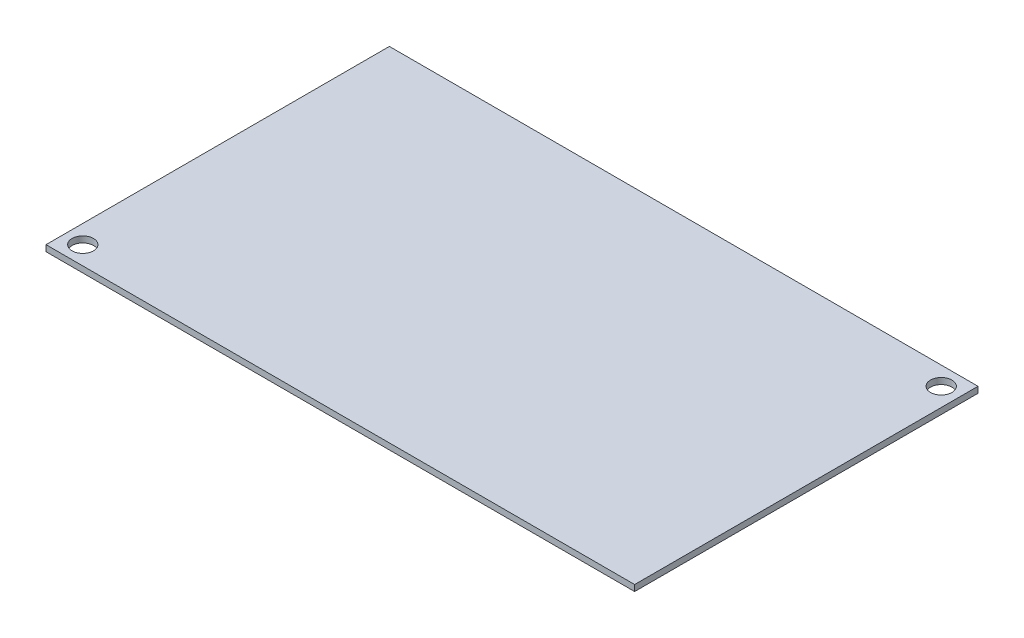
ISO-10303-21;
HEADER;
FILE_DESCRIPTION(('STEP AP214'),'2;1');
FILE_NAME('part.step','',(''),(''),'','','');
FILE_SCHEMA(('AUTOMOTIVE_DESIGN { 1 0 10303 214 1 1 1 1 }'));
ENDSEC;
DATA;
#1=APPLICATION_CONTEXT('core data for automotive mechanical design processes');
#2=APPLICATION_PROTOCOL_DEFINITION('international standard','automotive_design',2000,#1);
#3=PRODUCT_CONTEXT('',#1,'mechanical');
#4=PRODUCT('Part','Part','',(#3));
#5=PRODUCT_RELATED_PRODUCT_CATEGORY('part','',(#4));
#6=PRODUCT_DEFINITION_FORMATION('','',#4);
#7=PRODUCT_DEFINITION_CONTEXT('part definition',#1,'design');
#8=PRODUCT_DEFINITION('design','',#6,#7);
#9=PRODUCT_DEFINITION_SHAPE('','',#8);
#10=(LENGTH_UNIT() NAMED_UNIT(*) SI_UNIT(.MILLI.,.METRE.));
#11=(NAMED_UNIT(*) PLANE_ANGLE_UNIT() SI_UNIT($,.RADIAN.));
#12=(NAMED_UNIT(*) SI_UNIT($,.STERADIAN.) SOLID_ANGLE_UNIT());
#13=UNCERTAINTY_MEASURE_WITH_UNIT(LENGTH_MEASURE(1.E-05),#10,'distance_accuracy_value','');
#14=(GEOMETRIC_REPRESENTATION_CONTEXT(3) GLOBAL_UNCERTAINTY_ASSIGNED_CONTEXT((#13)) GLOBAL_UNIT_ASSIGNED_CONTEXT((#10,
#11,#12)) REPRESENTATION_CONTEXT('',''));
#15=CARTESIAN_POINT('',(0.,0.,0.));
#16=DIRECTION('',(0.,0.,1.));
#17=DIRECTION('',(1.,0.,0.));
#18=AXIS2_PLACEMENT_3D('',#15,#16,#17);
#19=CARTESIAN_POINT('',(0.,1.27,-71.12));
#20=DIRECTION('',(0.,-1.,0.));
#21=DIRECTION('',(0.,0.,-1.));
#22=AXIS2_PLACEMENT_3D('',#19,#20,#21);
#23=PLANE('',#22);
#24=CARTESIAN_POINT('',(3.81,1.27,-3.81));
#25=DIRECTION('',(0.,1.,0.));
#26=DIRECTION('',(0.,0.,1.));
#27=AXIS2_PLACEMENT_3D('',#24,#25,#26);
#28=CIRCLE('',#27,2.2225);
#29=CARTESIAN_POINT('',(3.81,1.27,-1.5875));
#30=VERTEX_POINT('',#29);
#31=EDGE_CURVE('E101',#30,#30,#28,.T.);
#32=ORIENTED_EDGE('',*,*,#31,.F.);
#33=EDGE_LOOP('',(#32));
#34=FACE_BOUND('',#33,.T.);
#35=DIRECTION('',(0.,0.,1.));
#36=VECTOR('',#35,1.);
#37=CARTESIAN_POINT('',(0.,1.27,0.));
#38=LINE('',#37,#36);
#39=CARTESIAN_POINT('',(0.,1.27,-71.12));
#40=VERTEX_POINT('',#39);
#41=CARTESIAN_POINT('',(0.,1.27,0.));
#42=VERTEX_POINT('',#41);
#43=EDGE_CURVE('E86',#40,#42,#38,.T.);
#44=ORIENTED_EDGE('',*,*,#43,.T.);
#45=DIRECTION('',(1.,0.,0.));
#46=VECTOR('',#45,1.);
#47=CARTESIAN_POINT('',(0.,1.27,0.));
#48=LINE('',#47,#46);
#49=CARTESIAN_POINT('',(121.92,1.27,0.));
#50=VERTEX_POINT('',#49);
#51=EDGE_CURVE('E81',#42,#50,#48,.T.);
#52=ORIENTED_EDGE('',*,*,#51,.T.);
#53=DIRECTION('',(0.,0.,-1.));
#54=VECTOR('',#53,1.);
#55=CARTESIAN_POINT('',(121.92,1.27,0.));
#56=LINE('',#55,#54);
#57=CARTESIAN_POINT('',(121.92,1.27,-71.12));
#58=VERTEX_POINT('',#57);
#59=EDGE_CURVE('E84',#50,#58,#56,.T.);
#60=ORIENTED_EDGE('',*,*,#59,.T.);
#61=DIRECTION('',(-1.,0.,0.));
#62=VECTOR('',#61,1.);
#63=CARTESIAN_POINT('',(0.,1.27,-71.12));
#64=LINE('',#63,#62);
#65=EDGE_CURVE('E51',#58,#40,#64,.T.);
#66=ORIENTED_EDGE('',*,*,#65,.T.);
#67=EDGE_LOOP('',(#44,#52,#60,#66));
#68=FACE_BOUND('',#67,.T.);
#69=CARTESIAN_POINT('',(118.11,1.27,-67.31));
#70=DIRECTION('',(0.,1.,0.));
#71=DIRECTION('',(0.,0.,1.));
#72=AXIS2_PLACEMENT_3D('',#69,#70,#71);
#73=CIRCLE('',#72,2.2225);
#74=CARTESIAN_POINT('',(118.11,1.27,-65.0875));
#75=VERTEX_POINT('',#74);
#76=EDGE_CURVE('E116',#75,#75,#73,.T.);
#77=ORIENTED_EDGE('',*,*,#76,.F.);
#78=EDGE_LOOP('',(#77));
#79=FACE_BOUND('',#78,.T.);
#80=ADVANCED_FACE('F34',(#34,#68,#79),#23,.F.);
#81=CARTESIAN_POINT('',(0.,0.,-71.12));
#82=DIRECTION('',(0.,-1.,0.));
#83=DIRECTION('',(0.,0.,-1.));
#84=AXIS2_PLACEMENT_3D('',#81,#82,#83);
#85=PLANE('',#84);
#86=CARTESIAN_POINT('',(3.81,0.,-3.81));
#87=DIRECTION('',(0.,1.,0.));
#88=DIRECTION('',(0.,0.,1.));
#89=AXIS2_PLACEMENT_3D('',#86,#87,#88);
#90=CIRCLE('',#89,2.2225);
#91=CARTESIAN_POINT('',(3.81,0.,-1.5875));
#92=VERTEX_POINT('',#91);
#93=EDGE_CURVE('E113',#92,#92,#90,.T.);
#94=ORIENTED_EDGE('',*,*,#93,.T.);
#95=EDGE_LOOP('',(#94));
#96=FACE_BOUND('',#95,.T.);
#97=DIRECTION('',(0.,0.,1.));
#98=VECTOR('',#97,1.);
#99=CARTESIAN_POINT('',(0.,0.,0.));
#100=LINE('',#99,#98);
#101=CARTESIAN_POINT('',(0.,0.,-71.12));
#102=VERTEX_POINT('',#101);
#103=CARTESIAN_POINT('',(0.,0.,0.));
#104=VERTEX_POINT('',#103);
#105=EDGE_CURVE('E98',#102,#104,#100,.T.);
#106=ORIENTED_EDGE('',*,*,#105,.F.);
#107=DIRECTION('',(-1.,0.,0.));
#108=VECTOR('',#107,1.);
#109=CARTESIAN_POINT('',(0.,0.,-71.12));
#110=LINE('',#109,#108);
#111=CARTESIAN_POINT('',(121.92,0.,-71.12));
#112=VERTEX_POINT('',#111);
#113=EDGE_CURVE('E74',#112,#102,#110,.T.);
#114=ORIENTED_EDGE('',*,*,#113,.F.);
#115=DIRECTION('',(0.,0.,-1.));
#116=VECTOR('',#115,1.);
#117=CARTESIAN_POINT('',(121.92,0.,0.));
#118=LINE('',#117,#116);
#119=CARTESIAN_POINT('',(121.92,0.,0.));
#120=VERTEX_POINT('',#119);
#121=EDGE_CURVE('E68',#120,#112,#118,.T.);
#122=ORIENTED_EDGE('',*,*,#121,.F.);
#123=DIRECTION('',(1.,0.,0.));
#124=VECTOR('',#123,1.);
#125=CARTESIAN_POINT('',(0.,0.,0.));
#126=LINE('',#125,#124);
#127=EDGE_CURVE('E90',#104,#120,#126,.T.);
#128=ORIENTED_EDGE('',*,*,#127,.F.);
#129=EDGE_LOOP('',(#106,#114,#122,#128));
#130=FACE_BOUND('',#129,.T.);
#131=CARTESIAN_POINT('',(118.11,0.,-67.31));
#132=DIRECTION('',(0.,1.,0.));
#133=DIRECTION('',(0.,0.,1.));
#134=AXIS2_PLACEMENT_3D('',#131,#132,#133);
#135=CIRCLE('',#134,2.2225);
#136=CARTESIAN_POINT('',(118.11,0.,-65.0875));
#137=VERTEX_POINT('',#136);
#138=EDGE_CURVE('E119',#137,#137,#135,.T.);
#139=ORIENTED_EDGE('',*,*,#138,.T.);
#140=EDGE_LOOP('',(#139));
#141=FACE_BOUND('',#140,.T.);
#142=ADVANCED_FACE('F109',(#96,#130,#141),#85,.T.);
#143=CARTESIAN_POINT('',(0.,1.27,0.));
#144=DIRECTION('',(1.,0.,0.));
#145=DIRECTION('',(0.,0.,-1.));
#146=AXIS2_PLACEMENT_3D('',#143,#144,#145);
#147=PLANE('',#146);
#148=ORIENTED_EDGE('',*,*,#105,.T.);
#149=DIRECTION('',(0.,-1.,0.));
#150=VECTOR('',#149,1.);
#151=CARTESIAN_POINT('',(0.,1.27,0.));
#152=LINE('',#151,#150);
#153=EDGE_CURVE('E11',#42,#104,#152,.T.);
#154=ORIENTED_EDGE('',*,*,#153,.F.);
#155=ORIENTED_EDGE('',*,*,#43,.F.);
#156=DIRECTION('',(0.,-1.,0.));
#157=VECTOR('',#156,1.);
#158=CARTESIAN_POINT('',(0.,1.27,-71.12));
#159=LINE('',#158,#157);
#160=EDGE_CURVE('E94',#40,#102,#159,.T.);
#161=ORIENTED_EDGE('',*,*,#160,.T.);
#162=EDGE_LOOP('',(#148,#154,#155,#161));
#163=FACE_BOUND('',#162,.T.);
#164=ADVANCED_FACE('F36',(#163),#147,.F.);
#165=CARTESIAN_POINT('',(0.,1.27,0.));
#166=DIRECTION('',(0.,0.,-1.));
#167=DIRECTION('',(-1.,0.,0.));
#168=AXIS2_PLACEMENT_3D('',#165,#166,#167);
#169=PLANE('',#168);
#170=ORIENTED_EDGE('',*,*,#127,.T.);
#171=DIRECTION('',(0.,-1.,0.));
#172=VECTOR('',#171,1.);
#173=CARTESIAN_POINT('',(121.92,1.27,0.));
#174=LINE('',#173,#172);
#175=EDGE_CURVE('E43',#50,#120,#174,.T.);
#176=ORIENTED_EDGE('',*,*,#175,.F.);
#177=ORIENTED_EDGE('',*,*,#51,.F.);
#178=ORIENTED_EDGE('',*,*,#153,.T.);
#179=EDGE_LOOP('',(#170,#176,#177,#178));
#180=FACE_BOUND('',#179,.T.);
#181=ADVANCED_FACE('F89',(#180),#169,.F.);
#182=CARTESIAN_POINT('',(121.92,1.27,0.));
#183=DIRECTION('',(-1.,0.,0.));
#184=DIRECTION('',(0.,0.,1.));
#185=AXIS2_PLACEMENT_3D('',#182,#183,#184);
#186=PLANE('',#185);
#187=ORIENTED_EDGE('',*,*,#121,.T.);
#188=DIRECTION('',(0.,-1.,0.));
#189=VECTOR('',#188,1.);
#190=CARTESIAN_POINT('',(121.92,1.27,-71.12));
#191=LINE('',#190,#189);
#192=EDGE_CURVE('E91',#58,#112,#191,.T.);
#193=ORIENTED_EDGE('',*,*,#192,.F.);
#194=ORIENTED_EDGE('',*,*,#59,.F.);
#195=ORIENTED_EDGE('',*,*,#175,.T.);
#196=EDGE_LOOP('',(#187,#193,#194,#195));
#197=FACE_BOUND('',#196,.T.);
#198=ADVANCED_FACE('F92',(#197),#186,.F.);
#199=CARTESIAN_POINT('',(0.,1.27,-71.12));
#200=DIRECTION('',(0.,0.,1.));
#201=DIRECTION('',(1.,0.,0.));
#202=AXIS2_PLACEMENT_3D('',#199,#200,#201);
#203=PLANE('',#202);
#204=ORIENTED_EDGE('',*,*,#113,.T.);
#205=ORIENTED_EDGE('',*,*,#160,.F.);
#206=ORIENTED_EDGE('',*,*,#65,.F.);
#207=ORIENTED_EDGE('',*,*,#192,.T.);
#208=EDGE_LOOP('',(#204,#205,#206,#207));
#209=FACE_BOUND('',#208,.T.);
#210=ADVANCED_FACE('F106',(#209),#203,.F.);
#211=CARTESIAN_POINT('',(3.81,1.27,-3.81));
#212=DIRECTION('',(0.,-1.,0.));
#213=DIRECTION('',(0.,0.,-1.));
#214=AXIS2_PLACEMENT_3D('',#211,#212,#213);
#215=CYLINDRICAL_SURFACE('',#214,2.2225);
#216=ORIENTED_EDGE('',*,*,#31,.T.);
#217=EDGE_LOOP('',(#216));
#218=FACE_BOUND('',#217,.T.);
#219=ORIENTED_EDGE('',*,*,#93,.F.);
#220=EDGE_LOOP('',(#219));
#221=FACE_BOUND('',#220,.T.);
#222=ADVANCED_FACE('F137',(#218,#221),#215,.F.);
#223=CARTESIAN_POINT('',(118.11,1.27,-67.31));
#224=DIRECTION('',(0.,-1.,0.));
#225=DIRECTION('',(0.,0.,-1.));
#226=AXIS2_PLACEMENT_3D('',#223,#224,#225);
#227=CYLINDRICAL_SURFACE('',#226,2.2225);
#228=ORIENTED_EDGE('',*,*,#76,.T.);
#229=EDGE_LOOP('',(#228));
#230=FACE_BOUND('',#229,.T.);
#231=ORIENTED_EDGE('',*,*,#138,.F.);
#232=EDGE_LOOP('',(#231));
#233=FACE_BOUND('',#232,.T.);
#234=ADVANCED_FACE('F125',(#230,#233),#227,.F.);
#235=CLOSED_SHELL('',(#80,#142,#164,#181,#198,#210,#222,#234));
#236=MANIFOLD_SOLID_BREP('B2',#235);
#237=ADVANCED_BREP_SHAPE_REPRESENTATION('',(#18,#236),#14);
#238=SHAPE_DEFINITION_REPRESENTATION(#9,#237);
ENDSEC;
END-ISO-10303-21;
